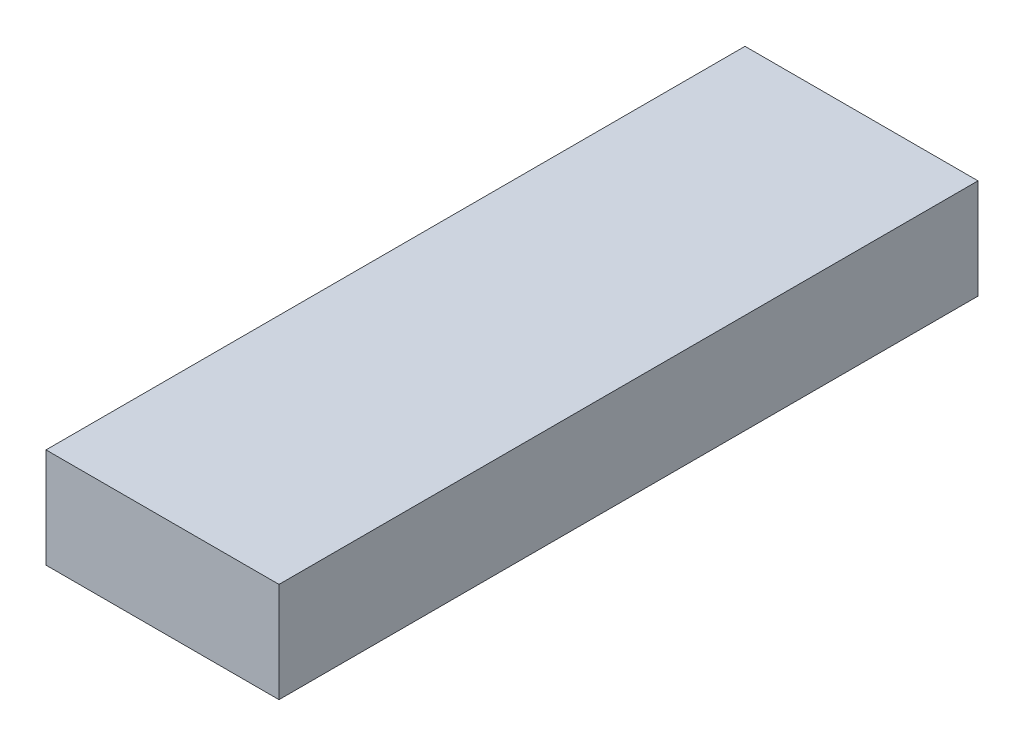
ISO-10303-21;
HEADER;
FILE_DESCRIPTION(('STEP AP214'),'2;1');
FILE_NAME('part.step','',(''),(''),'','','');
FILE_SCHEMA(('AUTOMOTIVE_DESIGN { 1 0 10303 214 1 1 1 1 }'));
ENDSEC;
DATA;
#1=APPLICATION_CONTEXT('core data for automotive mechanical design processes');
#2=APPLICATION_PROTOCOL_DEFINITION('international standard','automotive_design',2000,#1);
#3=PRODUCT_CONTEXT('',#1,'mechanical');
#4=PRODUCT('Part','Part','',(#3));
#5=PRODUCT_RELATED_PRODUCT_CATEGORY('part','',(#4));
#6=PRODUCT_DEFINITION_FORMATION('','',#4);
#7=PRODUCT_DEFINITION_CONTEXT('part definition',#1,'design');
#8=PRODUCT_DEFINITION('design','',#6,#7);
#9=PRODUCT_DEFINITION_SHAPE('','',#8);
#10=(LENGTH_UNIT() NAMED_UNIT(*) SI_UNIT(.MILLI.,.METRE.));
#11=(NAMED_UNIT(*) PLANE_ANGLE_UNIT() SI_UNIT($,.RADIAN.));
#12=(NAMED_UNIT(*) SI_UNIT($,.STERADIAN.) SOLID_ANGLE_UNIT());
#13=UNCERTAINTY_MEASURE_WITH_UNIT(LENGTH_MEASURE(1.E-05),#10,'distance_accuracy_value','');
#14=(GEOMETRIC_REPRESENTATION_CONTEXT(3) GLOBAL_UNCERTAINTY_ASSIGNED_CONTEXT((#13)) GLOBAL_UNIT_ASSIGNED_CONTEXT((#10,
#11,#12)) REPRESENTATION_CONTEXT('',''));
#15=CARTESIAN_POINT('',(0.,0.,0.));
#16=DIRECTION('',(0.,0.,1.));
#17=DIRECTION('',(1.,0.,0.));
#18=AXIS2_PLACEMENT_3D('',#15,#16,#17);
#19=CARTESIAN_POINT('',(0.,0.,21.));
#20=DIRECTION('',(1.,0.,0.));
#21=DIRECTION('',(0.,0.,-1.));
#22=AXIS2_PLACEMENT_3D('',#19,#20,#21);
#23=PLANE('',#22);
#24=DIRECTION('',(0.,-1.,0.));
#25=VECTOR('',#24,1.);
#26=CARTESIAN_POINT('',(0.,0.,0.));
#27=LINE('',#26,#25);
#28=CARTESIAN_POINT('',(0.,3.,0.));
#29=VERTEX_POINT('',#28);
#30=CARTESIAN_POINT('',(0.,0.,0.));
#31=VERTEX_POINT('',#30);
#32=EDGE_CURVE('E111',#29,#31,#27,.T.);
#33=ORIENTED_EDGE('',*,*,#32,.T.);
#34=DIRECTION('',(0.,0.,-1.));
#35=VECTOR('',#34,1.);
#36=CARTESIAN_POINT('',(0.,0.,21.));
#37=LINE('',#36,#35);
#38=CARTESIAN_POINT('',(0.,0.,21.));
#39=VERTEX_POINT('',#38);
#40=EDGE_CURVE('E11',#39,#31,#37,.T.);
#41=ORIENTED_EDGE('',*,*,#40,.F.);
#42=DIRECTION('',(0.,-1.,0.));
#43=VECTOR('',#42,1.);
#44=CARTESIAN_POINT('',(0.,0.,21.));
#45=LINE('',#44,#43);
#46=CARTESIAN_POINT('',(0.,3.,21.));
#47=VERTEX_POINT('',#46);
#48=EDGE_CURVE('E100',#47,#39,#45,.T.);
#49=ORIENTED_EDGE('',*,*,#48,.F.);
#50=DIRECTION('',(0.,0.,-1.));
#51=VECTOR('',#50,1.);
#52=CARTESIAN_POINT('',(0.,3.,21.));
#53=LINE('',#52,#51);
#54=EDGE_CURVE('E108',#47,#29,#53,.T.);
#55=ORIENTED_EDGE('',*,*,#54,.T.);
#56=EDGE_LOOP('',(#33,#41,#49,#55));
#57=FACE_BOUND('',#56,.T.);
#58=ADVANCED_FACE('F44',(#57),#23,.F.);
#59=CARTESIAN_POINT('',(0.,0.,21.));
#60=DIRECTION('',(0.,1.,0.));
#61=DIRECTION('',(0.,0.,1.));
#62=AXIS2_PLACEMENT_3D('',#59,#60,#61);
#63=PLANE('',#62);
#64=DIRECTION('',(1.,0.,0.));
#65=VECTOR('',#64,1.);
#66=CARTESIAN_POINT('',(0.,0.,0.));
#67=LINE('',#66,#65);
#68=CARTESIAN_POINT('',(7.,0.,0.));
#69=VERTEX_POINT('',#68);
#70=EDGE_CURVE('E105',#31,#69,#67,.T.);
#71=ORIENTED_EDGE('',*,*,#70,.T.);
#72=DIRECTION('',(0.,0.,-1.));
#73=VECTOR('',#72,1.);
#74=CARTESIAN_POINT('',(7.,0.,21.));
#75=LINE('',#74,#73);
#76=CARTESIAN_POINT('',(7.,0.,21.));
#77=VERTEX_POINT('',#76);
#78=EDGE_CURVE('E53',#77,#69,#75,.T.);
#79=ORIENTED_EDGE('',*,*,#78,.F.);
#80=DIRECTION('',(1.,0.,0.));
#81=VECTOR('',#80,1.);
#82=CARTESIAN_POINT('',(0.,0.,21.));
#83=LINE('',#82,#81);
#84=EDGE_CURVE('E95',#39,#77,#83,.T.);
#85=ORIENTED_EDGE('',*,*,#84,.F.);
#86=ORIENTED_EDGE('',*,*,#40,.T.);
#87=EDGE_LOOP('',(#71,#79,#85,#86));
#88=FACE_BOUND('',#87,.T.);
#89=ADVANCED_FACE('F102',(#88),#63,.F.);
#90=CARTESIAN_POINT('',(7.,3.,21.));
#91=DIRECTION('',(-1.,0.,0.));
#92=DIRECTION('',(0.,0.,1.));
#93=AXIS2_PLACEMENT_3D('',#90,#91,#92);
#94=PLANE('',#93);
#95=DIRECTION('',(0.,1.,0.));
#96=VECTOR('',#95,1.);
#97=CARTESIAN_POINT('',(7.,3.,0.));
#98=LINE('',#97,#96);
#99=CARTESIAN_POINT('',(7.,3.,0.));
#100=VERTEX_POINT('',#99);
#101=EDGE_CURVE('E80',#69,#100,#98,.T.);
#102=ORIENTED_EDGE('',*,*,#101,.T.);
#103=DIRECTION('',(0.,0.,-1.));
#104=VECTOR('',#103,1.);
#105=CARTESIAN_POINT('',(7.,3.,21.));
#106=LINE('',#105,#104);
#107=CARTESIAN_POINT('',(7.,3.,21.));
#108=VERTEX_POINT('',#107);
#109=EDGE_CURVE('E101',#108,#100,#106,.T.);
#110=ORIENTED_EDGE('',*,*,#109,.F.);
#111=DIRECTION('',(0.,1.,0.));
#112=VECTOR('',#111,1.);
#113=CARTESIAN_POINT('',(7.,3.,21.));
#114=LINE('',#113,#112);
#115=EDGE_CURVE('E94',#77,#108,#114,.T.);
#116=ORIENTED_EDGE('',*,*,#115,.F.);
#117=ORIENTED_EDGE('',*,*,#78,.T.);
#118=EDGE_LOOP('',(#102,#110,#116,#117));
#119=FACE_BOUND('',#118,.T.);
#120=ADVANCED_FACE('F103',(#119),#94,.F.);
#121=CARTESIAN_POINT('',(0.,3.,21.));
#122=DIRECTION('',(0.,-1.,0.));
#123=DIRECTION('',(0.,0.,-1.));
#124=AXIS2_PLACEMENT_3D('',#121,#122,#123);
#125=PLANE('',#124);
#126=DIRECTION('',(-1.,0.,0.));
#127=VECTOR('',#126,1.);
#128=CARTESIAN_POINT('',(0.,3.,0.));
#129=LINE('',#128,#127);
#130=EDGE_CURVE('E82',#100,#29,#129,.T.);
#131=ORIENTED_EDGE('',*,*,#130,.T.);
#132=ORIENTED_EDGE('',*,*,#54,.F.);
#133=DIRECTION('',(-1.,0.,0.));
#134=VECTOR('',#133,1.);
#135=CARTESIAN_POINT('',(0.,3.,21.));
#136=LINE('',#135,#134);
#137=EDGE_CURVE('E62',#108,#47,#136,.T.);
#138=ORIENTED_EDGE('',*,*,#137,.F.);
#139=ORIENTED_EDGE('',*,*,#109,.T.);
#140=EDGE_LOOP('',(#131,#132,#138,#139));
#141=FACE_BOUND('',#140,.T.);
#142=ADVANCED_FACE('F128',(#141),#125,.F.);
#143=CARTESIAN_POINT('',(0.,0.,21.));
#144=DIRECTION('',(0.,0.,-1.));
#145=DIRECTION('',(-1.,0.,0.));
#146=AXIS2_PLACEMENT_3D('',#143,#144,#145);
#147=PLANE('',#146);
#148=ORIENTED_EDGE('',*,*,#48,.T.);
#149=ORIENTED_EDGE('',*,*,#84,.T.);
#150=ORIENTED_EDGE('',*,*,#115,.T.);
#151=ORIENTED_EDGE('',*,*,#137,.T.);
#152=EDGE_LOOP('',(#148,#149,#150,#151));
#153=FACE_BOUND('',#152,.T.);
#154=ADVANCED_FACE('F93',(#153),#147,.F.);
#155=CARTESIAN_POINT('',(0.,0.,0.));
#156=DIRECTION('',(0.,0.,-1.));
#157=DIRECTION('',(-1.,0.,0.));
#158=AXIS2_PLACEMENT_3D('',#155,#156,#157);
#159=PLANE('',#158);
#160=ORIENTED_EDGE('',*,*,#32,.F.);
#161=ORIENTED_EDGE('',*,*,#130,.F.);
#162=ORIENTED_EDGE('',*,*,#101,.F.);
#163=ORIENTED_EDGE('',*,*,#70,.F.);
#164=EDGE_LOOP('',(#160,#161,#162,#163));
#165=FACE_BOUND('',#164,.T.);
#166=ADVANCED_FACE('F129',(#165),#159,.T.);
#167=CLOSED_SHELL('',(#58,#89,#120,#142,#154,#166));
#168=MANIFOLD_SOLID_BREP('B2',#167);
#169=ADVANCED_BREP_SHAPE_REPRESENTATION('',(#18,#168),#14);
#170=SHAPE_DEFINITION_REPRESENTATION(#9,#169);
ENDSEC;
END-ISO-10303-21;
